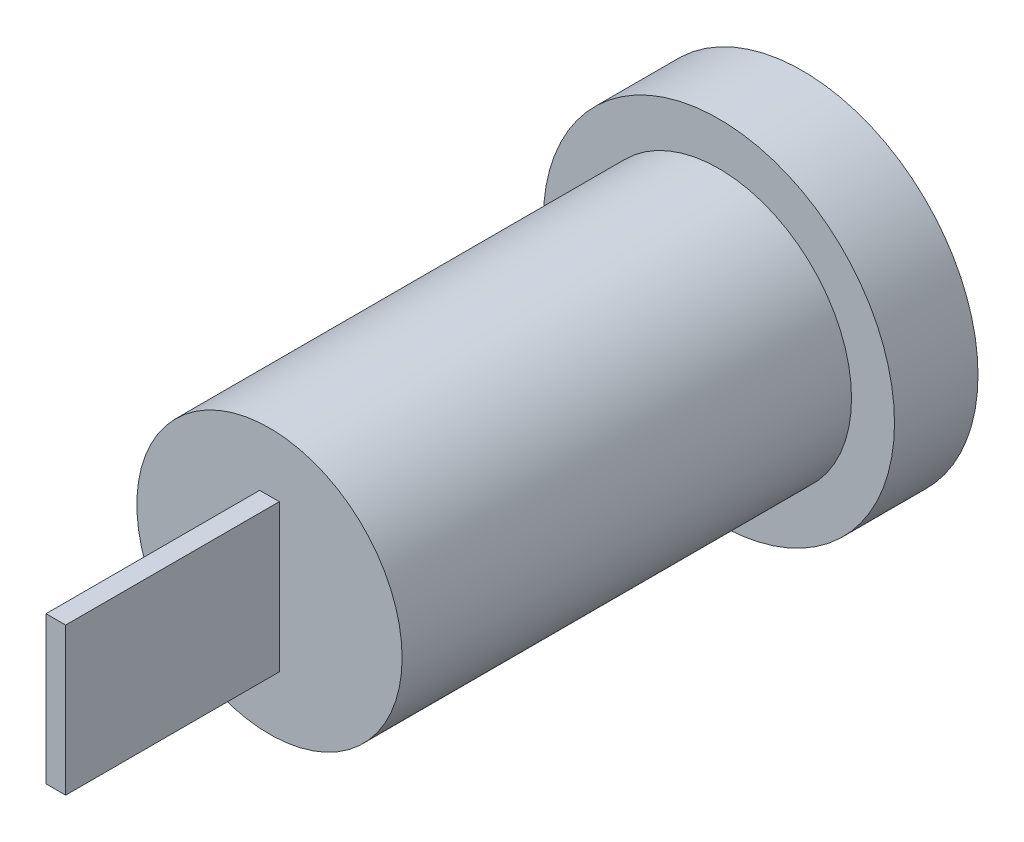
ISO-10303-21;
HEADER;
FILE_DESCRIPTION(('STEP AP214'),'2;1');
FILE_NAME('part.step','',(''),(''),'','','');
FILE_SCHEMA(('AUTOMOTIVE_DESIGN { 1 0 10303 214 1 1 1 1 }'));
ENDSEC;
DATA;
#1=APPLICATION_CONTEXT('core data for automotive mechanical design processes');
#2=APPLICATION_PROTOCOL_DEFINITION('international standard','automotive_design',2000,#1);
#3=PRODUCT_CONTEXT('',#1,'mechanical');
#4=PRODUCT('Part','Part','',(#3));
#5=PRODUCT_RELATED_PRODUCT_CATEGORY('part','',(#4));
#6=PRODUCT_DEFINITION_FORMATION('','',#4);
#7=PRODUCT_DEFINITION_CONTEXT('part definition',#1,'design');
#8=PRODUCT_DEFINITION('design','',#6,#7);
#9=PRODUCT_DEFINITION_SHAPE('','',#8);
#10=(LENGTH_UNIT() NAMED_UNIT(*) SI_UNIT(.MILLI.,.METRE.));
#11=(NAMED_UNIT(*) PLANE_ANGLE_UNIT() SI_UNIT($,.RADIAN.));
#12=(NAMED_UNIT(*) SI_UNIT($,.STERADIAN.) SOLID_ANGLE_UNIT());
#13=UNCERTAINTY_MEASURE_WITH_UNIT(LENGTH_MEASURE(1.E-05),#10,'distance_accuracy_value','');
#14=(GEOMETRIC_REPRESENTATION_CONTEXT(3) GLOBAL_UNCERTAINTY_ASSIGNED_CONTEXT((#13)) GLOBAL_UNIT_ASSIGNED_CONTEXT((#10,
#11,#12)) REPRESENTATION_CONTEXT('',''));
#15=CARTESIAN_POINT('',(0.,0.,0.));
#16=DIRECTION('',(0.,0.,1.));
#17=DIRECTION('',(1.,0.,0.));
#18=AXIS2_PLACEMENT_3D('',#15,#16,#17);
#19=CARTESIAN_POINT('',(0.,0.,18.3));
#20=DIRECTION('',(0.,0.,1.));
#21=DIRECTION('',(1.,0.,0.));
#22=AXIS2_PLACEMENT_3D('',#19,#20,#21);
#23=PLANE('',#22);
#24=CARTESIAN_POINT('',(0.,0.,18.3));
#25=DIRECTION('',(0.,0.,1.));
#26=DIRECTION('',(1.,0.,0.));
#27=AXIS2_PLACEMENT_3D('',#24,#25,#26);
#28=CIRCLE('',#27,5.4);
#29=CARTESIAN_POINT('',(5.4,0.,18.3));
#30=VERTEX_POINT('',#29);
#31=EDGE_CURVE('E14',#30,#30,#28,.T.);
#32=ORIENTED_EDGE('',*,*,#31,.T.);
#33=EDGE_LOOP('',(#32));
#34=FACE_BOUND('',#33,.T.);
#35=DIRECTION('',(-1.,0.,0.));
#36=VECTOR('',#35,1.);
#37=CARTESIAN_POINT('',(0.4,3.,18.3));
#38=LINE('',#37,#36);
#39=CARTESIAN_POINT('',(0.4,3.,18.3));
#40=VERTEX_POINT('',#39);
#41=CARTESIAN_POINT('',(-0.4,3.,18.3));
#42=VERTEX_POINT('',#41);
#43=EDGE_CURVE('E110',#40,#42,#38,.T.);
#44=ORIENTED_EDGE('',*,*,#43,.F.);
#45=DIRECTION('',(0.,1.,0.));
#46=VECTOR('',#45,1.);
#47=CARTESIAN_POINT('',(0.4,3.,18.3));
#48=LINE('',#47,#46);
#49=CARTESIAN_POINT('',(0.4,-3.,18.3));
#50=VERTEX_POINT('',#49);
#51=EDGE_CURVE('E121',#50,#40,#48,.T.);
#52=ORIENTED_EDGE('',*,*,#51,.F.);
#53=DIRECTION('',(1.,0.,0.));
#54=VECTOR('',#53,1.);
#55=CARTESIAN_POINT('',(0.4,-3.,18.3));
#56=LINE('',#55,#54);
#57=CARTESIAN_POINT('',(-0.4,-3.,18.3));
#58=VERTEX_POINT('',#57);
#59=EDGE_CURVE('E91',#58,#50,#56,.T.);
#60=ORIENTED_EDGE('',*,*,#59,.F.);
#61=DIRECTION('',(0.,-1.,0.));
#62=VECTOR('',#61,1.);
#63=CARTESIAN_POINT('',(-0.4,3.,18.3));
#64=LINE('',#63,#62);
#65=EDGE_CURVE('E125',#42,#58,#64,.T.);
#66=ORIENTED_EDGE('',*,*,#65,.F.);
#67=EDGE_LOOP('',(#44,#52,#60,#66));
#68=FACE_BOUND('',#67,.T.);
#69=ADVANCED_FACE('F54',(#34,#68),#23,.T.);
#70=CARTESIAN_POINT('',(0.,0.,18.3));
#71=DIRECTION('',(0.,0.,-1.));
#72=DIRECTION('',(-1.,0.,0.));
#73=AXIS2_PLACEMENT_3D('',#70,#71,#72);
#74=CYLINDRICAL_SURFACE('',#73,5.4);
#75=ORIENTED_EDGE('',*,*,#31,.F.);
#76=EDGE_LOOP('',(#75));
#77=FACE_BOUND('',#76,.T.);
#78=CARTESIAN_POINT('',(0.,0.,0.));
#79=DIRECTION('',(0.,0.,1.));
#80=DIRECTION('',(1.,0.,0.));
#81=AXIS2_PLACEMENT_3D('',#78,#79,#80);
#82=CIRCLE('',#81,5.4);
#83=CARTESIAN_POINT('',(5.4,0.,0.));
#84=VERTEX_POINT('',#83);
#85=EDGE_CURVE('E58',#84,#84,#82,.T.);
#86=ORIENTED_EDGE('',*,*,#85,.T.);
#87=EDGE_LOOP('',(#86));
#88=FACE_BOUND('',#87,.T.);
#89=ADVANCED_FACE('F56',(#77,#88),#74,.T.);
#90=CARTESIAN_POINT('',(0.,0.,-3.4));
#91=DIRECTION('',(0.,0.,1.));
#92=DIRECTION('',(1.,0.,0.));
#93=AXIS2_PLACEMENT_3D('',#90,#91,#92);
#94=CYLINDRICAL_SURFACE('',#93,7.15);
#95=CARTESIAN_POINT('',(0.,0.,-3.4));
#96=DIRECTION('',(0.,0.,-1.));
#97=DIRECTION('',(-1.,0.,0.));
#98=AXIS2_PLACEMENT_3D('',#95,#96,#97);
#99=CIRCLE('',#98,7.15);
#100=CARTESIAN_POINT('',(-7.15,0.,-3.4));
#101=VERTEX_POINT('',#100);
#102=EDGE_CURVE('E150',#101,#101,#99,.T.);
#103=ORIENTED_EDGE('',*,*,#102,.F.);
#104=EDGE_LOOP('',(#103));
#105=FACE_BOUND('',#104,.T.);
#106=CARTESIAN_POINT('',(0.,0.,0.));
#107=DIRECTION('',(0.,0.,-1.));
#108=DIRECTION('',(-1.,0.,0.));
#109=AXIS2_PLACEMENT_3D('',#106,#107,#108);
#110=CIRCLE('',#109,7.15);
#111=CARTESIAN_POINT('',(-7.15,0.,0.));
#112=VERTEX_POINT('',#111);
#113=EDGE_CURVE('E147',#112,#112,#110,.T.);
#114=ORIENTED_EDGE('',*,*,#113,.T.);
#115=EDGE_LOOP('',(#114));
#116=FACE_BOUND('',#115,.T.);
#117=ADVANCED_FACE('F156',(#105,#116),#94,.T.);
#118=CARTESIAN_POINT('',(0.,0.,-3.4));
#119=DIRECTION('',(0.,0.,-1.));
#120=DIRECTION('',(-1.,0.,0.));
#121=AXIS2_PLACEMENT_3D('',#118,#119,#120);
#122=PLANE('',#121);
#123=CARTESIAN_POINT('',(0.,0.,-3.4));
#124=DIRECTION('',(0.,0.,-1.));
#125=DIRECTION('',(-1.,0.,0.));
#126=AXIS2_PLACEMENT_3D('',#123,#124,#125);
#127=CIRCLE('',#126,4.15);
#128=CARTESIAN_POINT('',(-4.15,0.,-3.4));
#129=VERTEX_POINT('',#128);
#130=EDGE_CURVE('E141',#129,#129,#127,.T.);
#131=ORIENTED_EDGE('',*,*,#130,.F.);
#132=EDGE_LOOP('',(#131));
#133=FACE_BOUND('',#132,.T.);
#134=ORIENTED_EDGE('',*,*,#102,.T.);
#135=EDGE_LOOP('',(#134));
#136=FACE_BOUND('',#135,.T.);
#137=ADVANCED_FACE('F161',(#133,#136),#122,.T.);
#138=CARTESIAN_POINT('',(0.,0.,0.));
#139=DIRECTION('',(0.,0.,-1.));
#140=DIRECTION('',(-1.,0.,0.));
#141=AXIS2_PLACEMENT_3D('',#138,#139,#140);
#142=PLANE('',#141);
#143=ORIENTED_EDGE('',*,*,#85,.F.);
#144=EDGE_LOOP('',(#143));
#145=FACE_BOUND('',#144,.T.);
#146=ORIENTED_EDGE('',*,*,#113,.F.);
#147=EDGE_LOOP('',(#146));
#148=FACE_BOUND('',#147,.T.);
#149=ADVANCED_FACE('F158',(#145,#148),#142,.F.);
#150=CARTESIAN_POINT('',(0.,0.,0.));
#151=DIRECTION('',(0.,0.,-1.));
#152=DIRECTION('',(-1.,0.,0.));
#153=AXIS2_PLACEMENT_3D('',#150,#151,#152);
#154=CYLINDRICAL_SURFACE('',#153,4.15);
#155=CARTESIAN_POINT('',(0.,0.,0.));
#156=DIRECTION('',(0.,0.,-1.));
#157=DIRECTION('',(-1.,0.,0.));
#158=AXIS2_PLACEMENT_3D('',#155,#156,#157);
#159=CIRCLE('',#158,4.15);
#160=CARTESIAN_POINT('',(-4.15,0.,0.));
#161=VERTEX_POINT('',#160);
#162=EDGE_CURVE('E144',#161,#161,#159,.T.);
#163=ORIENTED_EDGE('',*,*,#162,.F.);
#164=EDGE_LOOP('',(#163));
#165=FACE_BOUND('',#164,.T.);
#166=ORIENTED_EDGE('',*,*,#130,.T.);
#167=EDGE_LOOP('',(#166));
#168=FACE_BOUND('',#167,.T.);
#169=ADVANCED_FACE('F160',(#165,#168),#154,.F.);
#170=CARTESIAN_POINT('',(0.,0.,0.));
#171=DIRECTION('',(0.,0.,-1.));
#172=DIRECTION('',(-1.,0.,0.));
#173=AXIS2_PLACEMENT_3D('',#170,#171,#172);
#174=PLANE('',#173);
#175=CARTESIAN_POINT('',(0.,0.,0.));
#176=DIRECTION('',(0.,0.,-1.));
#177=DIRECTION('',(-1.,0.,0.));
#178=AXIS2_PLACEMENT_3D('',#175,#176,#177);
#179=CIRCLE('',#178,3.);
#180=CARTESIAN_POINT('',(-3.,0.,0.));
#181=VERTEX_POINT('',#180);
#182=EDGE_CURVE('E138',#181,#181,#179,.T.);
#183=ORIENTED_EDGE('',*,*,#182,.F.);
#184=EDGE_LOOP('',(#183));
#185=FACE_BOUND('',#184,.T.);
#186=ORIENTED_EDGE('',*,*,#162,.T.);
#187=EDGE_LOOP('',(#186));
#188=FACE_BOUND('',#187,.T.);
#189=ADVANCED_FACE('F168',(#185,#188),#174,.T.);
#190=CARTESIAN_POINT('',(0.,0.,0.));
#191=DIRECTION('',(0.,0.,-1.));
#192=DIRECTION('',(-1.,0.,0.));
#193=AXIS2_PLACEMENT_3D('',#190,#191,#192);
#194=CYLINDRICAL_SURFACE('',#193,3.);
#195=ORIENTED_EDGE('',*,*,#182,.T.);
#196=EDGE_LOOP('',(#195));
#197=FACE_BOUND('',#196,.T.);
#198=CARTESIAN_POINT('',(0.,0.,-3.4));
#199=DIRECTION('',(0.,0.,-1.));
#200=DIRECTION('',(-1.,0.,0.));
#201=AXIS2_PLACEMENT_3D('',#198,#199,#200);
#202=CIRCLE('',#201,3.);
#203=CARTESIAN_POINT('',(-3.,0.,-3.4));
#204=VERTEX_POINT('',#203);
#205=EDGE_CURVE('E135',#204,#204,#202,.T.);
#206=ORIENTED_EDGE('',*,*,#205,.F.);
#207=EDGE_LOOP('',(#206));
#208=FACE_BOUND('',#207,.T.);
#209=ADVANCED_FACE('F213',(#197,#208),#194,.T.);
#210=CARTESIAN_POINT('',(0.,0.,-3.4));
#211=DIRECTION('',(0.,0.,-1.));
#212=DIRECTION('',(-1.,0.,0.));
#213=AXIS2_PLACEMENT_3D('',#210,#211,#212);
#214=CIRCLE('',#213,2.);
#215=CARTESIAN_POINT('',(-2.,0.,-3.4));
#216=VERTEX_POINT('',#215);
#217=EDGE_CURVE('E131',#216,#216,#214,.T.);
#218=ORIENTED_EDGE('',*,*,#217,.F.);
#219=EDGE_LOOP('',(#218));
#220=FACE_BOUND('',#219,.T.);
#221=ORIENTED_EDGE('',*,*,#205,.T.);
#222=EDGE_LOOP('',(#221));
#223=FACE_BOUND('',#222,.T.);
#224=ADVANCED_FACE('F173',(#220,#223),#122,.T.);
#225=CARTESIAN_POINT('',(0.,0.,0.));
#226=DIRECTION('',(0.,0.,-1.));
#227=DIRECTION('',(-1.,0.,0.));
#228=AXIS2_PLACEMENT_3D('',#225,#226,#227);
#229=CYLINDRICAL_SURFACE('',#228,2.);
#230=CARTESIAN_POINT('',(0.,0.,0.));
#231=DIRECTION('',(0.,0.,-1.));
#232=DIRECTION('',(-1.,0.,0.));
#233=AXIS2_PLACEMENT_3D('',#230,#231,#232);
#234=CIRCLE('',#233,2.);
#235=CARTESIAN_POINT('',(-2.,0.,0.));
#236=VERTEX_POINT('',#235);
#237=EDGE_CURVE('E132',#236,#236,#234,.T.);
#238=ORIENTED_EDGE('',*,*,#237,.F.);
#239=EDGE_LOOP('',(#238));
#240=FACE_BOUND('',#239,.T.);
#241=ORIENTED_EDGE('',*,*,#217,.T.);
#242=EDGE_LOOP('',(#241));
#243=FACE_BOUND('',#242,.T.);
#244=ADVANCED_FACE('F232',(#240,#243),#229,.F.);
#245=CARTESIAN_POINT('',(0.,0.,0.));
#246=DIRECTION('',(0.,0.,-1.));
#247=DIRECTION('',(-1.,0.,0.));
#248=AXIS2_PLACEMENT_3D('',#245,#246,#247);
#249=PLANE('',#248);
#250=ORIENTED_EDGE('',*,*,#237,.T.);
#251=EDGE_LOOP('',(#250));
#252=FACE_BOUND('',#251,.T.);
#253=ADVANCED_FACE('F240',(#252),#249,.T.);
#254=CARTESIAN_POINT('',(0.4,3.,27.));
#255=DIRECTION('',(-1.,0.,0.));
#256=DIRECTION('',(0.,0.,1.));
#257=AXIS2_PLACEMENT_3D('',#254,#255,#256);
#258=PLANE('',#257);
#259=ORIENTED_EDGE('',*,*,#51,.T.);
#260=DIRECTION('',(0.,0.,-1.));
#261=VECTOR('',#260,1.);
#262=CARTESIAN_POINT('',(0.4,3.,27.));
#263=LINE('',#262,#261);
#264=CARTESIAN_POINT('',(0.4,3.,27.));
#265=VERTEX_POINT('',#264);
#266=EDGE_CURVE('E113',#265,#40,#263,.T.);
#267=ORIENTED_EDGE('',*,*,#266,.F.);
#268=DIRECTION('',(0.,1.,0.));
#269=VECTOR('',#268,1.);
#270=CARTESIAN_POINT('',(0.4,3.,27.));
#271=LINE('',#270,#269);
#272=CARTESIAN_POINT('',(0.4,-3.,27.));
#273=VERTEX_POINT('',#272);
#274=EDGE_CURVE('E103',#273,#265,#271,.T.);
#275=ORIENTED_EDGE('',*,*,#274,.F.);
#276=DIRECTION('',(0.,0.,-1.));
#277=VECTOR('',#276,1.);
#278=CARTESIAN_POINT('',(0.4,-3.,27.));
#279=LINE('',#278,#277);
#280=EDGE_CURVE('E117',#273,#50,#279,.T.);
#281=ORIENTED_EDGE('',*,*,#280,.T.);
#282=EDGE_LOOP('',(#259,#267,#275,#281));
#283=FACE_BOUND('',#282,.T.);
#284=ADVANCED_FACE('F249',(#283),#258,.F.);
#285=CARTESIAN_POINT('',(0.4,3.,27.));
#286=DIRECTION('',(0.,-1.,0.));
#287=DIRECTION('',(0.,0.,-1.));
#288=AXIS2_PLACEMENT_3D('',#285,#286,#287);
#289=PLANE('',#288);
#290=ORIENTED_EDGE('',*,*,#43,.T.);
#291=DIRECTION('',(0.,0.,-1.));
#292=VECTOR('',#291,1.);
#293=CARTESIAN_POINT('',(-0.4,3.,27.));
#294=LINE('',#293,#292);
#295=CARTESIAN_POINT('',(-0.4,3.,27.));
#296=VERTEX_POINT('',#295);
#297=EDGE_CURVE('E107',#296,#42,#294,.T.);
#298=ORIENTED_EDGE('',*,*,#297,.F.);
#299=DIRECTION('',(-1.,0.,0.));
#300=VECTOR('',#299,1.);
#301=CARTESIAN_POINT('',(0.4,3.,27.));
#302=LINE('',#301,#300);
#303=EDGE_CURVE('E98',#265,#296,#302,.T.);
#304=ORIENTED_EDGE('',*,*,#303,.F.);
#305=ORIENTED_EDGE('',*,*,#266,.T.);
#306=EDGE_LOOP('',(#290,#298,#304,#305));
#307=FACE_BOUND('',#306,.T.);
#308=ADVANCED_FACE('F108',(#307),#289,.F.);
#309=CARTESIAN_POINT('',(-0.4,3.,27.));
#310=DIRECTION('',(1.,0.,0.));
#311=DIRECTION('',(0.,0.,-1.));
#312=AXIS2_PLACEMENT_3D('',#309,#310,#311);
#313=PLANE('',#312);
#314=ORIENTED_EDGE('',*,*,#65,.T.);
#315=DIRECTION('',(0.,0.,-1.));
#316=VECTOR('',#315,1.);
#317=CARTESIAN_POINT('',(-0.4,-3.,27.));
#318=LINE('',#317,#316);
#319=CARTESIAN_POINT('',(-0.4,-3.,27.));
#320=VERTEX_POINT('',#319);
#321=EDGE_CURVE('E69',#320,#58,#318,.T.);
#322=ORIENTED_EDGE('',*,*,#321,.F.);
#323=DIRECTION('',(0.,-1.,0.));
#324=VECTOR('',#323,1.);
#325=CARTESIAN_POINT('',(-0.4,3.,27.));
#326=LINE('',#325,#324);
#327=EDGE_CURVE('E101',#296,#320,#326,.T.);
#328=ORIENTED_EDGE('',*,*,#327,.F.);
#329=ORIENTED_EDGE('',*,*,#297,.T.);
#330=EDGE_LOOP('',(#314,#322,#328,#329));
#331=FACE_BOUND('',#330,.T.);
#332=ADVANCED_FACE('F115',(#331),#313,.F.);
#333=CARTESIAN_POINT('',(0.4,-3.,27.));
#334=DIRECTION('',(0.,1.,0.));
#335=DIRECTION('',(0.,0.,1.));
#336=AXIS2_PLACEMENT_3D('',#333,#334,#335);
#337=PLANE('',#336);
#338=ORIENTED_EDGE('',*,*,#59,.T.);
#339=ORIENTED_EDGE('',*,*,#280,.F.);
#340=DIRECTION('',(1.,0.,0.));
#341=VECTOR('',#340,1.);
#342=CARTESIAN_POINT('',(0.4,-3.,27.));
#343=LINE('',#342,#341);
#344=EDGE_CURVE('E77',#320,#273,#343,.T.);
#345=ORIENTED_EDGE('',*,*,#344,.F.);
#346=ORIENTED_EDGE('',*,*,#321,.T.);
#347=EDGE_LOOP('',(#338,#339,#345,#346));
#348=FACE_BOUND('',#347,.T.);
#349=ADVANCED_FACE('F281',(#348),#337,.F.);
#350=CARTESIAN_POINT('',(0.,0.,27.));
#351=DIRECTION('',(0.,0.,-1.));
#352=DIRECTION('',(-1.,0.,0.));
#353=AXIS2_PLACEMENT_3D('',#350,#351,#352);
#354=PLANE('',#353);
#355=ORIENTED_EDGE('',*,*,#274,.T.);
#356=ORIENTED_EDGE('',*,*,#303,.T.);
#357=ORIENTED_EDGE('',*,*,#327,.T.);
#358=ORIENTED_EDGE('',*,*,#344,.T.);
#359=EDGE_LOOP('',(#355,#356,#357,#358));
#360=FACE_BOUND('',#359,.T.);
#361=ADVANCED_FACE('F99',(#360),#354,.F.);
#362=CLOSED_SHELL('',(#69,#89,#117,#137,#149,#169,#189,#209,#224,#244,#253,#284,#308,#332,#349,#361));
#363=MANIFOLD_SOLID_BREP('B2',#362);
#364=ADVANCED_BREP_SHAPE_REPRESENTATION('',(#18,#363),#14);
#365=SHAPE_DEFINITION_REPRESENTATION(#9,#364);
ENDSEC;
END-ISO-10303-21;
